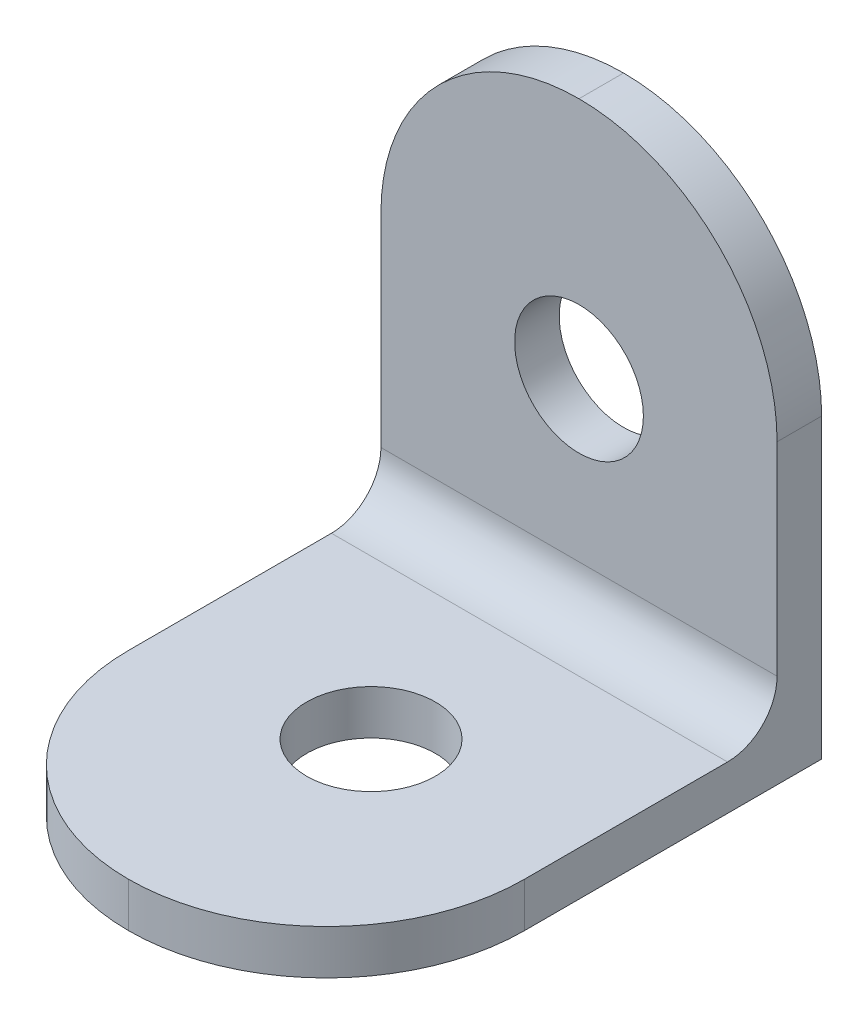
ISO-10303-21;
HEADER;
FILE_DESCRIPTION(('STEP AP214'),'2;1');
FILE_NAME('part.step','',(''),(''),'','','');
FILE_SCHEMA(('AUTOMOTIVE_DESIGN { 1 0 10303 214 1 1 1 1 }'));
ENDSEC;
DATA;
#1=APPLICATION_CONTEXT('core data for automotive mechanical design processes');
#2=APPLICATION_PROTOCOL_DEFINITION('international standard','automotive_design',2000,#1);
#3=PRODUCT_CONTEXT('',#1,'mechanical');
#4=PRODUCT('Part','Part','',(#3));
#5=PRODUCT_RELATED_PRODUCT_CATEGORY('part','',(#4));
#6=PRODUCT_DEFINITION_FORMATION('','',#4);
#7=PRODUCT_DEFINITION_CONTEXT('part definition',#1,'design');
#8=PRODUCT_DEFINITION('design','',#6,#7);
#9=PRODUCT_DEFINITION_SHAPE('','',#8);
#10=(LENGTH_UNIT() NAMED_UNIT(*) SI_UNIT(.MILLI.,.METRE.));
#11=(NAMED_UNIT(*) PLANE_ANGLE_UNIT() SI_UNIT($,.RADIAN.));
#12=(NAMED_UNIT(*) SI_UNIT($,.STERADIAN.) SOLID_ANGLE_UNIT());
#13=UNCERTAINTY_MEASURE_WITH_UNIT(LENGTH_MEASURE(1.E-05),#10,'distance_accuracy_value','');
#14=(GEOMETRIC_REPRESENTATION_CONTEXT(3) GLOBAL_UNCERTAINTY_ASSIGNED_CONTEXT((#13)) GLOBAL_UNIT_ASSIGNED_CONTEXT((#10,
#11,#12)) REPRESENTATION_CONTEXT('',''));
#15=CARTESIAN_POINT('',(0.,0.,0.));
#16=DIRECTION('',(0.,0.,1.));
#17=DIRECTION('',(1.,0.,0.));
#18=AXIS2_PLACEMENT_3D('',#15,#16,#17);
#19=CARTESIAN_POINT('',(0.,0.,1.8));
#20=DIRECTION('',(1.,0.,0.));
#21=DIRECTION('',(0.,0.,-1.));
#22=AXIS2_PLACEMENT_3D('',#19,#20,#21);
#23=PLANE('',#22);
#24=DIRECTION('',(0.,0.,-1.));
#25=VECTOR('',#24,1.);
#26=CARTESIAN_POINT('',(0.,0.,1.8));
#27=LINE('',#26,#25);
#28=CARTESIAN_POINT('',(0.,0.,12.));
#29=VERTEX_POINT('',#28);
#30=CARTESIAN_POINT('',(0.,0.,0.));
#31=VERTEX_POINT('',#30);
#32=EDGE_CURVE('E114',#29,#31,#27,.T.);
#33=ORIENTED_EDGE('',*,*,#32,.F.);
#34=DIRECTION('',(0.,-1.,0.));
#35=VECTOR('',#34,1.);
#36=CARTESIAN_POINT('',(0.,1.8,12.));
#37=LINE('',#36,#35);
#38=CARTESIAN_POINT('',(0.,1.8,12.));
#39=VERTEX_POINT('',#38);
#40=EDGE_CURVE('E167',#29,#39,#37,.F.);
#41=ORIENTED_EDGE('',*,*,#40,.T.);
#42=DIRECTION('',(0.,0.,-1.));
#43=VECTOR('',#42,1.);
#44=CARTESIAN_POINT('',(0.,1.8,1.8));
#45=LINE('',#44,#43);
#46=CARTESIAN_POINT('',(0.,1.8,3.8));
#47=VERTEX_POINT('',#46);
#48=EDGE_CURVE('E194',#39,#47,#45,.T.);
#49=ORIENTED_EDGE('',*,*,#48,.T.);
#50=CARTESIAN_POINT('',(0.,3.8,3.8));
#51=DIRECTION('',(1.,0.,0.));
#52=DIRECTION('',(0.,0.,-1.));
#53=AXIS2_PLACEMENT_3D('',#50,#51,#52);
#54=CIRCLE('',#53,2.);
#55=CARTESIAN_POINT('',(0.,3.8,1.8));
#56=VERTEX_POINT('',#55);
#57=EDGE_CURVE('E150',#47,#56,#54,.T.);
#58=ORIENTED_EDGE('',*,*,#57,.T.);
#59=DIRECTION('',(0.,-1.,0.));
#60=VECTOR('',#59,1.);
#61=CARTESIAN_POINT('',(0.,0.,1.8));
#62=LINE('',#61,#60);
#63=CARTESIAN_POINT('',(0.,12.,1.8));
#64=VERTEX_POINT('',#63);
#65=EDGE_CURVE('E137',#64,#56,#62,.T.);
#66=ORIENTED_EDGE('',*,*,#65,.F.);
#67=DIRECTION('',(0.,0.,-1.));
#68=VECTOR('',#67,1.);
#69=CARTESIAN_POINT('',(0.,12.,1.8));
#70=LINE('',#69,#68);
#71=CARTESIAN_POINT('',(0.,12.,0.));
#72=VERTEX_POINT('',#71);
#73=EDGE_CURVE('E118',#64,#72,#70,.T.);
#74=ORIENTED_EDGE('',*,*,#73,.T.);
#75=DIRECTION('',(0.,-1.,0.));
#76=VECTOR('',#75,1.);
#77=CARTESIAN_POINT('',(0.,0.,0.));
#78=LINE('',#77,#76);
#79=EDGE_CURVE('E112',#72,#31,#78,.T.);
#80=ORIENTED_EDGE('',*,*,#79,.T.);
#81=EDGE_LOOP('',(#33,#41,#49,#58,#66,#74,#80));
#82=FACE_BOUND('',#81,.T.);
#83=ADVANCED_FACE('F41',(#82),#23,.F.);
#84=CARTESIAN_POINT('',(0.,0.,1.8));
#85=DIRECTION('',(0.,1.,0.));
#86=DIRECTION('',(0.,0.,1.));
#87=AXIS2_PLACEMENT_3D('',#84,#85,#86);
#88=PLANE('',#87);
#89=CARTESIAN_POINT('',(8.,0.,10.2));
#90=DIRECTION('',(0.,1.,0.));
#91=DIRECTION('',(0.,0.,1.));
#92=AXIS2_PLACEMENT_3D('',#89,#90,#91);
#93=CIRCLE('',#92,2.6);
#94=CARTESIAN_POINT('',(8.,0.,12.8));
#95=VERTEX_POINT('',#94);
#96=EDGE_CURVE('E179',#95,#95,#93,.T.);
#97=ORIENTED_EDGE('',*,*,#96,.T.);
#98=EDGE_LOOP('',(#97));
#99=FACE_BOUND('',#98,.T.);
#100=DIRECTION('',(0.,0.,-1.));
#101=VECTOR('',#100,1.);
#102=CARTESIAN_POINT('',(16.,0.,1.8));
#103=LINE('',#102,#101);
#104=CARTESIAN_POINT('',(16.,0.,12.));
#105=VERTEX_POINT('',#104);
#106=CARTESIAN_POINT('',(16.,0.,0.));
#107=VERTEX_POINT('',#106);
#108=EDGE_CURVE('E131',#105,#107,#103,.T.);
#109=ORIENTED_EDGE('',*,*,#108,.F.);
#110=CARTESIAN_POINT('',(8.,0.,12.));
#111=DIRECTION('',(0.,1.,0.));
#112=DIRECTION('',(0.,0.,1.));
#113=AXIS2_PLACEMENT_3D('',#110,#111,#112);
#114=CIRCLE('',#113,8.);
#115=CARTESIAN_POINT('',(8.,0.,20.));
#116=VERTEX_POINT('',#115);
#117=EDGE_CURVE('E160',#105,#116,#114,.F.);
#118=ORIENTED_EDGE('',*,*,#117,.T.);
#119=CARTESIAN_POINT('',(8.,0.,12.));
#120=DIRECTION('',(0.,1.,0.));
#121=DIRECTION('',(0.,0.,1.));
#122=AXIS2_PLACEMENT_3D('',#119,#120,#121);
#123=CIRCLE('',#122,8.);
#124=EDGE_CURVE('E129',#116,#29,#123,.F.);
#125=ORIENTED_EDGE('',*,*,#124,.T.);
#126=ORIENTED_EDGE('',*,*,#32,.T.);
#127=DIRECTION('',(1.,0.,0.));
#128=VECTOR('',#127,1.);
#129=CARTESIAN_POINT('',(0.,0.,0.));
#130=LINE('',#129,#128);
#131=EDGE_CURVE('E120',#31,#107,#130,.T.);
#132=ORIENTED_EDGE('',*,*,#131,.T.);
#133=EDGE_LOOP('',(#109,#118,#125,#126,#132));
#134=FACE_BOUND('',#133,.T.);
#135=ADVANCED_FACE('F126',(#99,#134),#88,.F.);
#136=CARTESIAN_POINT('',(16.,0.,1.8));
#137=DIRECTION('',(-1.,0.,0.));
#138=DIRECTION('',(0.,0.,1.));
#139=AXIS2_PLACEMENT_3D('',#136,#137,#138);
#140=PLANE('',#139);
#141=DIRECTION('',(0.,0.,1.));
#142=VECTOR('',#141,1.);
#143=CARTESIAN_POINT('',(16.,1.8,1.8));
#144=LINE('',#143,#142);
#145=CARTESIAN_POINT('',(16.,1.8,3.8));
#146=VERTEX_POINT('',#145);
#147=CARTESIAN_POINT('',(16.,1.8,12.));
#148=VERTEX_POINT('',#147);
#149=EDGE_CURVE('E121',#146,#148,#144,.T.);
#150=ORIENTED_EDGE('',*,*,#149,.T.);
#151=DIRECTION('',(0.,-1.,0.));
#152=VECTOR('',#151,1.);
#153=CARTESIAN_POINT('',(16.,0.,12.));
#154=LINE('',#153,#152);
#155=EDGE_CURVE('E156',#148,#105,#154,.T.);
#156=ORIENTED_EDGE('',*,*,#155,.T.);
#157=ORIENTED_EDGE('',*,*,#108,.T.);
#158=DIRECTION('',(0.,1.,0.));
#159=VECTOR('',#158,1.);
#160=CARTESIAN_POINT('',(16.,0.,0.));
#161=LINE('',#160,#159);
#162=CARTESIAN_POINT('',(16.,12.,0.));
#163=VERTEX_POINT('',#162);
#164=EDGE_CURVE('E135',#107,#163,#161,.T.);
#165=ORIENTED_EDGE('',*,*,#164,.T.);
#166=DIRECTION('',(0.,0.,-1.));
#167=VECTOR('',#166,1.);
#168=CARTESIAN_POINT('',(16.,12.,1.8));
#169=LINE('',#168,#167);
#170=CARTESIAN_POINT('',(16.,12.,1.8));
#171=VERTEX_POINT('',#170);
#172=EDGE_CURVE('E153',#163,#171,#169,.F.);
#173=ORIENTED_EDGE('',*,*,#172,.T.);
#174=DIRECTION('',(0.,1.,0.));
#175=VECTOR('',#174,1.);
#176=CARTESIAN_POINT('',(16.,0.,1.8));
#177=LINE('',#176,#175);
#178=CARTESIAN_POINT('',(16.,3.8,1.8));
#179=VERTEX_POINT('',#178);
#180=EDGE_CURVE('E141',#179,#171,#177,.T.);
#181=ORIENTED_EDGE('',*,*,#180,.F.);
#182=CARTESIAN_POINT('',(16.,3.8,3.8));
#183=DIRECTION('',(-1.,0.,0.));
#184=DIRECTION('',(0.,0.,1.));
#185=AXIS2_PLACEMENT_3D('',#182,#183,#184);
#186=CIRCLE('',#185,2.);
#187=EDGE_CURVE('E148',#179,#146,#186,.T.);
#188=ORIENTED_EDGE('',*,*,#187,.T.);
#189=EDGE_LOOP('',(#150,#156,#157,#165,#173,#181,#188));
#190=FACE_BOUND('',#189,.T.);
#191=ADVANCED_FACE('F226',(#190),#140,.F.);
#192=CARTESIAN_POINT('',(0.,0.,1.8));
#193=DIRECTION('',(0.,0.,-1.));
#194=DIRECTION('',(-1.,0.,0.));
#195=AXIS2_PLACEMENT_3D('',#192,#193,#194);
#196=PLANE('',#195);
#197=CARTESIAN_POINT('',(8.,10.2,1.8));
#198=DIRECTION('',(0.,0.,1.));
#199=DIRECTION('',(1.,0.,0.));
#200=AXIS2_PLACEMENT_3D('',#197,#198,#199);
#201=CIRCLE('',#200,2.6);
#202=CARTESIAN_POINT('',(10.6,10.2,1.8));
#203=VERTEX_POINT('',#202);
#204=EDGE_CURVE('E197',#203,#203,#201,.T.);
#205=ORIENTED_EDGE('',*,*,#204,.F.);
#206=EDGE_LOOP('',(#205));
#207=FACE_BOUND('',#206,.T.);
#208=ORIENTED_EDGE('',*,*,#180,.T.);
#209=CARTESIAN_POINT('',(8.,12.,1.8));
#210=DIRECTION('',(0.,0.,-1.));
#211=DIRECTION('',(-1.,0.,0.));
#212=AXIS2_PLACEMENT_3D('',#209,#210,#211);
#213=CIRCLE('',#212,8.);
#214=CARTESIAN_POINT('',(8.,20.,1.8));
#215=VERTEX_POINT('',#214);
#216=EDGE_CURVE('E11',#171,#215,#213,.F.);
#217=ORIENTED_EDGE('',*,*,#216,.T.);
#218=CARTESIAN_POINT('',(8.,12.,1.8));
#219=DIRECTION('',(0.,0.,-1.));
#220=DIRECTION('',(-1.,0.,0.));
#221=AXIS2_PLACEMENT_3D('',#218,#219,#220);
#222=CIRCLE('',#221,8.);
#223=EDGE_CURVE('E50',#215,#64,#222,.F.);
#224=ORIENTED_EDGE('',*,*,#223,.T.);
#225=ORIENTED_EDGE('',*,*,#65,.T.);
#226=DIRECTION('',(1.,0.,0.));
#227=VECTOR('',#226,1.);
#228=CARTESIAN_POINT('',(0.,3.8,1.8));
#229=LINE('',#228,#227);
#230=EDGE_CURVE('E130',#56,#179,#229,.T.);
#231=ORIENTED_EDGE('',*,*,#230,.T.);
#232=EDGE_LOOP('',(#208,#217,#224,#225,#231));
#233=FACE_BOUND('',#232,.T.);
#234=ADVANCED_FACE('F187',(#207,#233),#196,.F.);
#235=CARTESIAN_POINT('',(0.,0.,0.));
#236=DIRECTION('',(0.,0.,-1.));
#237=DIRECTION('',(-1.,0.,0.));
#238=AXIS2_PLACEMENT_3D('',#235,#236,#237);
#239=PLANE('',#238);
#240=CARTESIAN_POINT('',(8.,10.2,0.));
#241=DIRECTION('',(0.,0.,1.));
#242=DIRECTION('',(1.,0.,0.));
#243=AXIS2_PLACEMENT_3D('',#240,#241,#242);
#244=CIRCLE('',#243,2.6);
#245=CARTESIAN_POINT('',(10.6,10.2,0.));
#246=VERTEX_POINT('',#245);
#247=EDGE_CURVE('E196',#246,#246,#244,.T.);
#248=ORIENTED_EDGE('',*,*,#247,.T.);
#249=EDGE_LOOP('',(#248));
#250=FACE_BOUND('',#249,.T.);
#251=CARTESIAN_POINT('',(8.,12.,0.));
#252=DIRECTION('',(0.,0.,-1.));
#253=DIRECTION('',(-1.,0.,0.));
#254=AXIS2_PLACEMENT_3D('',#251,#252,#253);
#255=CIRCLE('',#254,8.);
#256=CARTESIAN_POINT('',(8.,20.,0.));
#257=VERTEX_POINT('',#256);
#258=EDGE_CURVE('E64',#72,#257,#255,.T.);
#259=ORIENTED_EDGE('',*,*,#258,.T.);
#260=CARTESIAN_POINT('',(8.,12.,0.));
#261=DIRECTION('',(0.,0.,-1.));
#262=DIRECTION('',(-1.,0.,0.));
#263=AXIS2_PLACEMENT_3D('',#260,#261,#262);
#264=CIRCLE('',#263,8.);
#265=EDGE_CURVE('E170',#257,#163,#264,.T.);
#266=ORIENTED_EDGE('',*,*,#265,.T.);
#267=ORIENTED_EDGE('',*,*,#164,.F.);
#268=ORIENTED_EDGE('',*,*,#131,.F.);
#269=ORIENTED_EDGE('',*,*,#79,.F.);
#270=EDGE_LOOP('',(#259,#266,#267,#268,#269));
#271=FACE_BOUND('',#270,.T.);
#272=ADVANCED_FACE('F133',(#250,#271),#239,.T.);
#273=CARTESIAN_POINT('',(0.,1.8,0.));
#274=DIRECTION('',(0.,1.,0.));
#275=DIRECTION('',(0.,0.,1.));
#276=AXIS2_PLACEMENT_3D('',#273,#274,#275);
#277=PLANE('',#276);
#278=CARTESIAN_POINT('',(8.,1.8,10.2));
#279=DIRECTION('',(0.,1.,0.));
#280=DIRECTION('',(0.,0.,1.));
#281=AXIS2_PLACEMENT_3D('',#278,#279,#280);
#282=CIRCLE('',#281,2.6);
#283=CARTESIAN_POINT('',(8.,1.8,12.8));
#284=VERTEX_POINT('',#283);
#285=EDGE_CURVE('E174',#284,#284,#282,.T.);
#286=ORIENTED_EDGE('',*,*,#285,.F.);
#287=EDGE_LOOP('',(#286));
#288=FACE_BOUND('',#287,.T.);
#289=CARTESIAN_POINT('',(8.,1.8,12.));
#290=DIRECTION('',(0.,1.,0.));
#291=DIRECTION('',(0.,0.,1.));
#292=AXIS2_PLACEMENT_3D('',#289,#290,#291);
#293=CIRCLE('',#292,8.);
#294=CARTESIAN_POINT('',(8.,1.8,20.));
#295=VERTEX_POINT('',#294);
#296=EDGE_CURVE('E162',#39,#295,#293,.T.);
#297=ORIENTED_EDGE('',*,*,#296,.T.);
#298=CARTESIAN_POINT('',(8.,1.8,12.));
#299=DIRECTION('',(0.,1.,0.));
#300=DIRECTION('',(0.,0.,1.));
#301=AXIS2_PLACEMENT_3D('',#298,#299,#300);
#302=CIRCLE('',#301,8.);
#303=EDGE_CURVE('E164',#295,#148,#302,.T.);
#304=ORIENTED_EDGE('',*,*,#303,.T.);
#305=ORIENTED_EDGE('',*,*,#149,.F.);
#306=DIRECTION('',(1.,0.,0.));
#307=VECTOR('',#306,1.);
#308=CARTESIAN_POINT('',(0.,1.8,3.8));
#309=LINE('',#308,#307);
#310=EDGE_CURVE('E145',#146,#47,#309,.F.);
#311=ORIENTED_EDGE('',*,*,#310,.T.);
#312=ORIENTED_EDGE('',*,*,#48,.F.);
#313=EDGE_LOOP('',(#297,#304,#305,#311,#312));
#314=FACE_BOUND('',#313,.T.);
#315=ADVANCED_FACE('F214',(#288,#314),#277,.T.);
#316=CARTESIAN_POINT('',(8.,10.2,0.));
#317=DIRECTION('',(0.,0.,1.));
#318=DIRECTION('',(1.,0.,0.));
#319=AXIS2_PLACEMENT_3D('',#316,#317,#318);
#320=CYLINDRICAL_SURFACE('',#319,2.6);
#321=ORIENTED_EDGE('',*,*,#247,.F.);
#322=EDGE_LOOP('',(#321));
#323=FACE_BOUND('',#322,.T.);
#324=ORIENTED_EDGE('',*,*,#204,.T.);
#325=EDGE_LOOP('',(#324));
#326=FACE_BOUND('',#325,.T.);
#327=ADVANCED_FACE('F210',(#323,#326),#320,.F.);
#328=CARTESIAN_POINT('',(8.,0.,10.2));
#329=DIRECTION('',(0.,1.,0.));
#330=DIRECTION('',(0.,0.,1.));
#331=AXIS2_PLACEMENT_3D('',#328,#329,#330);
#332=CYLINDRICAL_SURFACE('',#331,2.6);
#333=ORIENTED_EDGE('',*,*,#96,.F.);
#334=EDGE_LOOP('',(#333));
#335=FACE_BOUND('',#334,.T.);
#336=ORIENTED_EDGE('',*,*,#285,.T.);
#337=EDGE_LOOP('',(#336));
#338=FACE_BOUND('',#337,.T.);
#339=ADVANCED_FACE('F206',(#335,#338),#332,.F.);
#340=CARTESIAN_POINT('',(0.,3.8,3.8));
#341=DIRECTION('',(1.,0.,0.));
#342=DIRECTION('',(0.,0.,-1.));
#343=AXIS2_PLACEMENT_3D('',#340,#341,#342);
#344=CYLINDRICAL_SURFACE('',#343,2.);
#345=ORIENTED_EDGE('',*,*,#57,.F.);
#346=ORIENTED_EDGE('',*,*,#310,.F.);
#347=ORIENTED_EDGE('',*,*,#187,.F.);
#348=ORIENTED_EDGE('',*,*,#230,.F.);
#349=EDGE_LOOP('',(#345,#346,#347,#348));
#350=FACE_BOUND('',#349,.T.);
#351=ADVANCED_FACE('F209',(#350),#344,.F.);
#352=CARTESIAN_POINT('',(8.,1.8,12.));
#353=DIRECTION('',(0.,1.,0.));
#354=DIRECTION('',(0.,0.,1.));
#355=AXIS2_PLACEMENT_3D('',#352,#353,#354);
#356=CYLINDRICAL_SURFACE('',#355,8.);
#357=DIRECTION('',(0.,-1.,0.));
#358=VECTOR('',#357,1.);
#359=CARTESIAN_POINT('',(8.,0.,20.));
#360=LINE('',#359,#358);
#361=EDGE_CURVE('E172',#295,#116,#360,.T.);
#362=ORIENTED_EDGE('',*,*,#361,.F.);
#363=ORIENTED_EDGE('',*,*,#296,.F.);
#364=ORIENTED_EDGE('',*,*,#40,.F.);
#365=ORIENTED_EDGE('',*,*,#124,.F.);
#366=EDGE_LOOP('',(#362,#363,#364,#365));
#367=FACE_BOUND('',#366,.T.);
#368=ADVANCED_FACE('F222',(#367),#356,.T.);
#369=CARTESIAN_POINT('',(8.,0.,12.));
#370=DIRECTION('',(0.,1.,0.));
#371=DIRECTION('',(0.,0.,1.));
#372=AXIS2_PLACEMENT_3D('',#369,#370,#371);
#373=CYLINDRICAL_SURFACE('',#372,8.);
#374=ORIENTED_EDGE('',*,*,#303,.F.);
#375=ORIENTED_EDGE('',*,*,#361,.T.);
#376=ORIENTED_EDGE('',*,*,#117,.F.);
#377=ORIENTED_EDGE('',*,*,#155,.F.);
#378=EDGE_LOOP('',(#374,#375,#376,#377));
#379=FACE_BOUND('',#378,.T.);
#380=ADVANCED_FACE('F224',(#379),#373,.T.);
#381=CARTESIAN_POINT('',(8.,12.,1.8));
#382=DIRECTION('',(0.,0.,-1.));
#383=DIRECTION('',(-1.,0.,0.));
#384=AXIS2_PLACEMENT_3D('',#381,#382,#383);
#385=CYLINDRICAL_SURFACE('',#384,8.);
#386=ORIENTED_EDGE('',*,*,#73,.F.);
#387=ORIENTED_EDGE('',*,*,#223,.F.);
#388=DIRECTION('',(0.,0.,-1.));
#389=VECTOR('',#388,1.);
#390=CARTESIAN_POINT('',(8.,20.,1.8));
#391=LINE('',#390,#389);
#392=EDGE_CURVE('E45',#257,#215,#391,.F.);
#393=ORIENTED_EDGE('',*,*,#392,.F.);
#394=ORIENTED_EDGE('',*,*,#258,.F.);
#395=EDGE_LOOP('',(#386,#387,#393,#394));
#396=FACE_BOUND('',#395,.T.);
#397=ADVANCED_FACE('F43',(#396),#385,.T.);
#398=CARTESIAN_POINT('',(8.,12.,1.8));
#399=DIRECTION('',(0.,0.,-1.));
#400=DIRECTION('',(-1.,0.,0.));
#401=AXIS2_PLACEMENT_3D('',#398,#399,#400);
#402=CYLINDRICAL_SURFACE('',#401,8.);
#403=ORIENTED_EDGE('',*,*,#216,.F.);
#404=ORIENTED_EDGE('',*,*,#172,.F.);
#405=ORIENTED_EDGE('',*,*,#265,.F.);
#406=ORIENTED_EDGE('',*,*,#392,.T.);
#407=EDGE_LOOP('',(#403,#404,#405,#406));
#408=FACE_BOUND('',#407,.T.);
#409=ADVANCED_FACE('F184',(#408),#402,.T.);
#410=CLOSED_SHELL('',(#83,#135,#191,#234,#272,#315,#327,#339,#351,#368,#380,#397,#409));
#411=MANIFOLD_SOLID_BREP('B2',#410);
#412=ADVANCED_BREP_SHAPE_REPRESENTATION('',(#18,#411),#14);
#413=SHAPE_DEFINITION_REPRESENTATION(#9,#412);
ENDSEC;
END-ISO-10303-21;
